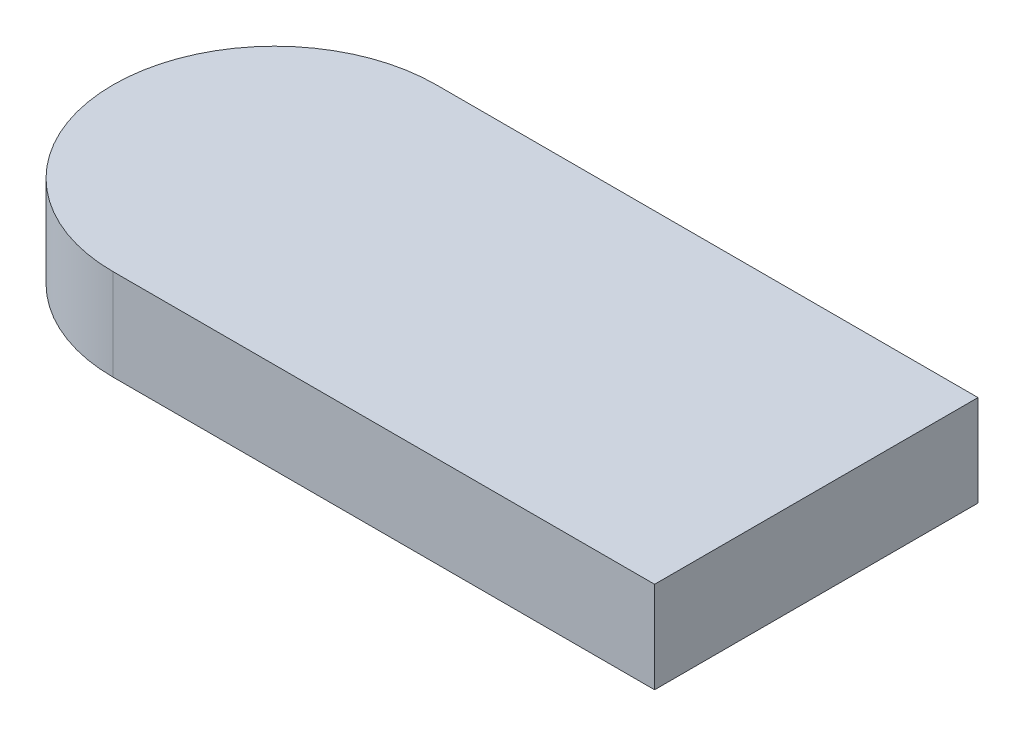
ISO-10303-21;
HEADER;
FILE_DESCRIPTION(('STEP AP214'),'2;1');
FILE_NAME('part.step','',(''),(''),'','','');
FILE_SCHEMA(('AUTOMOTIVE_DESIGN { 1 0 10303 214 1 1 1 1 }'));
ENDSEC;
DATA;
#1=APPLICATION_CONTEXT('core data for automotive mechanical design processes');
#2=APPLICATION_PROTOCOL_DEFINITION('international standard','automotive_design',2000,#1);
#3=PRODUCT_CONTEXT('',#1,'mechanical');
#4=PRODUCT('Part','Part','',(#3));
#5=PRODUCT_RELATED_PRODUCT_CATEGORY('part','',(#4));
#6=PRODUCT_DEFINITION_FORMATION('','',#4);
#7=PRODUCT_DEFINITION_CONTEXT('part definition',#1,'design');
#8=PRODUCT_DEFINITION('design','',#6,#7);
#9=PRODUCT_DEFINITION_SHAPE('','',#8);
#10=(LENGTH_UNIT() NAMED_UNIT(*) SI_UNIT(.MILLI.,.METRE.));
#11=(NAMED_UNIT(*) PLANE_ANGLE_UNIT() SI_UNIT($,.RADIAN.));
#12=(NAMED_UNIT(*) SI_UNIT($,.STERADIAN.) SOLID_ANGLE_UNIT());
#13=UNCERTAINTY_MEASURE_WITH_UNIT(LENGTH_MEASURE(1.E-05),#10,'distance_accuracy_value','');
#14=(GEOMETRIC_REPRESENTATION_CONTEXT(3) GLOBAL_UNCERTAINTY_ASSIGNED_CONTEXT((#13)) GLOBAL_UNIT_ASSIGNED_CONTEXT((#10,
#11,#12)) REPRESENTATION_CONTEXT('',''));
#15=CARTESIAN_POINT('',(0.,0.,0.));
#16=DIRECTION('',(0.,0.,1.));
#17=DIRECTION('',(1.,0.,0.));
#18=AXIS2_PLACEMENT_3D('',#15,#16,#17);
#19=CARTESIAN_POINT('',(0.,3.,0.));
#20=DIRECTION('',(0.,1.,0.));
#21=DIRECTION('',(0.,0.,1.));
#22=AXIS2_PLACEMENT_3D('',#19,#20,#21);
#23=PLANE('',#22);
#24=DIRECTION('',(1.,0.,0.));
#25=VECTOR('',#24,1.);
#26=CARTESIAN_POINT('',(0.,3.,-13.8377945992377));
#27=LINE('',#26,#25);
#28=CARTESIAN_POINT('',(-53.7678162076556,3.,-13.8377945992377));
#29=VERTEX_POINT('',#28);
#30=CARTESIAN_POINT('',(23.2721837923445,3.,-13.8377945992377));
#31=VERTEX_POINT('',#30);
#32=EDGE_CURVE('E165',#29,#31,#27,.T.);
#33=ORIENTED_EDGE('',*,*,#32,.F.);
#34=CARTESIAN_POINT('',(-53.7678162076556,3.,9.16220540076234));
#35=DIRECTION('',(0.,1.,0.));
#36=DIRECTION('',(0.,0.,1.));
#37=AXIS2_PLACEMENT_3D('',#34,#35,#36);
#38=CIRCLE('',#37,23.);
#39=CARTESIAN_POINT('',(-53.7678162076556,3.,32.1622054007623));
#40=VERTEX_POINT('',#39);
#41=EDGE_CURVE('E169',#29,#40,#38,.T.);
#42=ORIENTED_EDGE('',*,*,#41,.T.);
#43=DIRECTION('',(-1.,0.,0.));
#44=VECTOR('',#43,1.);
#45=CARTESIAN_POINT('',(0.,3.,32.1622054007623));
#46=LINE('',#45,#44);
#47=CARTESIAN_POINT('',(23.2721837923445,3.,32.1622054007623));
#48=VERTEX_POINT('',#47);
#49=EDGE_CURVE('E156',#48,#40,#46,.T.);
#50=ORIENTED_EDGE('',*,*,#49,.F.);
#51=DIRECTION('',(0.,0.,1.));
#52=VECTOR('',#51,1.);
#53=CARTESIAN_POINT('',(23.2721837923445,3.,0.));
#54=LINE('',#53,#52);
#55=EDGE_CURVE('E152',#31,#48,#54,.T.);
#56=ORIENTED_EDGE('',*,*,#55,.F.);
#57=EDGE_LOOP('',(#33,#42,#50,#56));
#58=FACE_BOUND('',#57,.T.);
#59=ADVANCED_FACE('F46',(#58),#23,.T.);
#60=CARTESIAN_POINT('',(-53.7678162076556,-12.,9.16220540076234));
#61=DIRECTION('',(0.,1.,0.));
#62=DIRECTION('',(0.,0.,1.));
#63=AXIS2_PLACEMENT_3D('',#60,#61,#62);
#64=CYLINDRICAL_SURFACE('',#63,20.);
#65=DIRECTION('',(0.,1.,0.));
#66=VECTOR('',#65,1.);
#67=CARTESIAN_POINT('',(-53.7678162076556,-12.,-10.8377945992377));
#68=LINE('',#67,#66);
#69=CARTESIAN_POINT('',(-53.7678162076556,-12.,-10.8377945992377));
#70=VERTEX_POINT('',#69);
#71=CARTESIAN_POINT('',(-53.7678162076556,0.,-10.8377945992377));
#72=VERTEX_POINT('',#71);
#73=EDGE_CURVE('E138',#70,#72,#68,.T.);
#74=ORIENTED_EDGE('',*,*,#73,.T.);
#75=CARTESIAN_POINT('',(-53.7678162076556,0.,9.16220540076234));
#76=DIRECTION('',(0.,1.,0.));
#77=DIRECTION('',(0.,0.,1.));
#78=AXIS2_PLACEMENT_3D('',#75,#76,#77);
#79=CIRCLE('',#78,20.);
#80=CARTESIAN_POINT('',(-53.7678162076556,0.,29.1622054007623));
#81=VERTEX_POINT('',#80);
#82=EDGE_CURVE('E196',#72,#81,#79,.T.);
#83=ORIENTED_EDGE('',*,*,#82,.T.);
#84=DIRECTION('',(0.,1.,0.));
#85=VECTOR('',#84,1.);
#86=CARTESIAN_POINT('',(-53.7678162076556,-12.,29.1622054007623));
#87=LINE('',#86,#85);
#88=CARTESIAN_POINT('',(-53.7678162076556,-12.,29.1622054007623));
#89=VERTEX_POINT('',#88);
#90=EDGE_CURVE('E150',#89,#81,#87,.T.);
#91=ORIENTED_EDGE('',*,*,#90,.F.);
#92=CARTESIAN_POINT('',(-53.7678162076556,-12.,9.16220540076234));
#93=DIRECTION('',(0.,1.,0.));
#94=DIRECTION('',(0.,0.,1.));
#95=AXIS2_PLACEMENT_3D('',#92,#93,#94);
#96=CIRCLE('',#95,20.);
#97=EDGE_CURVE('E129',#70,#89,#96,.T.);
#98=ORIENTED_EDGE('',*,*,#97,.F.);
#99=EDGE_LOOP('',(#74,#83,#91,#98));
#100=FACE_BOUND('',#99,.T.);
#101=ADVANCED_FACE('F148',(#100),#64,.F.);
#102=CARTESIAN_POINT('',(0.,-12.,29.1622054007623));
#103=DIRECTION('',(0.,0.,1.));
#104=DIRECTION('',(1.,0.,0.));
#105=AXIS2_PLACEMENT_3D('',#102,#103,#104);
#106=PLANE('',#105);
#107=ORIENTED_EDGE('',*,*,#90,.T.);
#108=DIRECTION('',(1.,0.,0.));
#109=VECTOR('',#108,1.);
#110=CARTESIAN_POINT('',(0.,0.,29.1622054007623));
#111=LINE('',#110,#109);
#112=CARTESIAN_POINT('',(20.2721837923445,0.,29.1622054007623));
#113=VERTEX_POINT('',#112);
#114=EDGE_CURVE('E199',#81,#113,#111,.T.);
#115=ORIENTED_EDGE('',*,*,#114,.T.);
#116=DIRECTION('',(0.,1.,0.));
#117=VECTOR('',#116,1.);
#118=CARTESIAN_POINT('',(20.2721837923445,-12.,29.1622054007623));
#119=LINE('',#118,#117);
#120=CARTESIAN_POINT('',(20.2721837923445,-12.,29.1622054007623));
#121=VERTEX_POINT('',#120);
#122=EDGE_CURVE('E178',#121,#113,#119,.T.);
#123=ORIENTED_EDGE('',*,*,#122,.F.);
#124=DIRECTION('',(1.,0.,0.));
#125=VECTOR('',#124,1.);
#126=CARTESIAN_POINT('',(0.,-12.,29.1622054007623));
#127=LINE('',#126,#125);
#128=EDGE_CURVE('E161',#89,#121,#127,.T.);
#129=ORIENTED_EDGE('',*,*,#128,.F.);
#130=EDGE_LOOP('',(#107,#115,#123,#129));
#131=FACE_BOUND('',#130,.T.);
#132=ADVANCED_FACE('F280',(#131),#106,.F.);
#133=CARTESIAN_POINT('',(20.2721837923445,-12.,0.));
#134=DIRECTION('',(1.,0.,0.));
#135=DIRECTION('',(0.,0.,-1.));
#136=AXIS2_PLACEMENT_3D('',#133,#134,#135);
#137=PLANE('',#136);
#138=ORIENTED_EDGE('',*,*,#122,.T.);
#139=DIRECTION('',(0.,0.,1.));
#140=VECTOR('',#139,1.);
#141=CARTESIAN_POINT('',(20.2721837923445,0.,0.));
#142=LINE('',#141,#140);
#143=CARTESIAN_POINT('',(20.2721837923445,0.,-10.8377945992377));
#144=VERTEX_POINT('',#143);
#145=EDGE_CURVE('E202',#144,#113,#142,.T.);
#146=ORIENTED_EDGE('',*,*,#145,.F.);
#147=DIRECTION('',(0.,1.,0.));
#148=VECTOR('',#147,1.);
#149=CARTESIAN_POINT('',(20.2721837923445,-12.,-10.8377945992377));
#150=LINE('',#149,#148);
#151=CARTESIAN_POINT('',(20.2721837923445,-12.,-10.8377945992377));
#152=VERTEX_POINT('',#151);
#153=EDGE_CURVE('E145',#152,#144,#150,.T.);
#154=ORIENTED_EDGE('',*,*,#153,.F.);
#155=DIRECTION('',(0.,0.,-1.));
#156=VECTOR('',#155,1.);
#157=CARTESIAN_POINT('',(20.2721837923445,-12.,0.));
#158=LINE('',#157,#156);
#159=EDGE_CURVE('E132',#121,#152,#158,.T.);
#160=ORIENTED_EDGE('',*,*,#159,.F.);
#161=EDGE_LOOP('',(#138,#146,#154,#160));
#162=FACE_BOUND('',#161,.T.);
#163=ADVANCED_FACE('F400',(#162),#137,.F.);
#164=CARTESIAN_POINT('',(0.,-12.,-10.8377945992377));
#165=DIRECTION('',(0.,0.,-1.));
#166=DIRECTION('',(-1.,0.,0.));
#167=AXIS2_PLACEMENT_3D('',#164,#165,#166);
#168=PLANE('',#167);
#169=ORIENTED_EDGE('',*,*,#153,.T.);
#170=DIRECTION('',(1.,0.,0.));
#171=VECTOR('',#170,1.);
#172=CARTESIAN_POINT('',(0.,0.,-10.8377945992377));
#173=LINE('',#172,#171);
#174=EDGE_CURVE('E141',#72,#144,#173,.T.);
#175=ORIENTED_EDGE('',*,*,#174,.F.);
#176=ORIENTED_EDGE('',*,*,#73,.F.);
#177=DIRECTION('',(-1.,0.,0.));
#178=VECTOR('',#177,1.);
#179=CARTESIAN_POINT('',(0.,-12.,-10.8377945992377));
#180=LINE('',#179,#178);
#181=EDGE_CURVE('E125',#152,#70,#180,.T.);
#182=ORIENTED_EDGE('',*,*,#181,.F.);
#183=EDGE_LOOP('',(#169,#175,#176,#182));
#184=FACE_BOUND('',#183,.T.);
#185=ADVANCED_FACE('F139',(#184),#168,.F.);
#186=CARTESIAN_POINT('',(0.,-12.,-13.8377945992377));
#187=DIRECTION('',(0.,0.,1.));
#188=DIRECTION('',(1.,0.,0.));
#189=AXIS2_PLACEMENT_3D('',#186,#187,#188);
#190=PLANE('',#189);
#191=DIRECTION('',(0.,1.,0.));
#192=VECTOR('',#191,1.);
#193=CARTESIAN_POINT('',(23.2721837923445,-12.,-13.8377945992377));
#194=LINE('',#193,#192);
#195=CARTESIAN_POINT('',(23.2721837923445,-9.99999999999999,-13.8377945992377));
#196=VERTEX_POINT('',#195);
#197=EDGE_CURVE('E146',#196,#31,#194,.T.);
#198=ORIENTED_EDGE('',*,*,#197,.F.);
#199=DIRECTION('',(-1.,0.,0.));
#200=VECTOR('',#199,1.);
#201=CARTESIAN_POINT('',(0.,-9.99999999999999,-13.8377945992377));
#202=LINE('',#201,#200);
#203=CARTESIAN_POINT('',(-53.7678162076556,-9.99999999999999,-13.8377945992377));
#204=VERTEX_POINT('',#203);
#205=EDGE_CURVE('E57',#196,#204,#202,.T.);
#206=ORIENTED_EDGE('',*,*,#205,.T.);
#207=DIRECTION('',(0.,1.,0.));
#208=VECTOR('',#207,1.);
#209=CARTESIAN_POINT('',(-53.7678162076556,-12.,-13.8377945992377));
#210=LINE('',#209,#208);
#211=EDGE_CURVE('E164',#204,#29,#210,.T.);
#212=ORIENTED_EDGE('',*,*,#211,.T.);
#213=ORIENTED_EDGE('',*,*,#32,.T.);
#214=EDGE_LOOP('',(#198,#206,#212,#213));
#215=FACE_BOUND('',#214,.T.);
#216=ADVANCED_FACE('F284',(#215),#190,.F.);
#217=CARTESIAN_POINT('',(23.2721837923445,-12.,0.));
#218=DIRECTION('',(-1.,0.,0.));
#219=DIRECTION('',(0.,0.,1.));
#220=AXIS2_PLACEMENT_3D('',#217,#218,#219);
#221=PLANE('',#220);
#222=DIRECTION('',(0.,1.,0.));
#223=VECTOR('',#222,1.);
#224=CARTESIAN_POINT('',(23.2721837923445,-12.,32.1622054007623));
#225=LINE('',#224,#223);
#226=CARTESIAN_POINT('',(23.2721837923445,-9.99999999999999,32.1622054007623));
#227=VERTEX_POINT('',#226);
#228=EDGE_CURVE('E186',#227,#48,#225,.T.);
#229=ORIENTED_EDGE('',*,*,#228,.F.);
#230=DIRECTION('',(0.,0.,-1.));
#231=VECTOR('',#230,1.);
#232=CARTESIAN_POINT('',(23.2721837923445,-9.99999999999999,0.));
#233=LINE('',#232,#231);
#234=EDGE_CURVE('E11',#227,#196,#233,.T.);
#235=ORIENTED_EDGE('',*,*,#234,.T.);
#236=ORIENTED_EDGE('',*,*,#197,.T.);
#237=ORIENTED_EDGE('',*,*,#55,.T.);
#238=EDGE_LOOP('',(#229,#235,#236,#237));
#239=FACE_BOUND('',#238,.T.);
#240=ADVANCED_FACE('F324',(#239),#221,.F.);
#241=CARTESIAN_POINT('',(0.,-12.,32.1622054007623));
#242=DIRECTION('',(0.,0.,-1.));
#243=DIRECTION('',(-1.,0.,0.));
#244=AXIS2_PLACEMENT_3D('',#241,#242,#243);
#245=PLANE('',#244);
#246=DIRECTION('',(0.,1.,0.));
#247=VECTOR('',#246,1.);
#248=CARTESIAN_POINT('',(-53.7678162076556,-12.,32.1622054007623));
#249=LINE('',#248,#247);
#250=CARTESIAN_POINT('',(-53.7678162076556,-9.99999999999999,32.1622054007623));
#251=VERTEX_POINT('',#250);
#252=EDGE_CURVE('E189',#251,#40,#249,.T.);
#253=ORIENTED_EDGE('',*,*,#252,.F.);
#254=DIRECTION('',(1.,0.,0.));
#255=VECTOR('',#254,1.);
#256=CARTESIAN_POINT('',(0.,-9.99999999999999,32.1622054007623));
#257=LINE('',#256,#255);
#258=EDGE_CURVE('E219',#251,#227,#257,.T.);
#259=ORIENTED_EDGE('',*,*,#258,.T.);
#260=ORIENTED_EDGE('',*,*,#228,.T.);
#261=ORIENTED_EDGE('',*,*,#49,.T.);
#262=EDGE_LOOP('',(#253,#259,#260,#261));
#263=FACE_BOUND('',#262,.T.);
#264=ADVANCED_FACE('F257',(#263),#245,.F.);
#265=CARTESIAN_POINT('',(-53.7678162076556,-12.,9.16220540076234));
#266=DIRECTION('',(0.,1.,0.));
#267=DIRECTION('',(0.,0.,1.));
#268=AXIS2_PLACEMENT_3D('',#265,#266,#267);
#269=CYLINDRICAL_SURFACE('',#268,23.);
#270=ORIENTED_EDGE('',*,*,#211,.F.);
#271=CARTESIAN_POINT('',(-53.7678162076556,-9.99999999999999,9.16220540076234));
#272=DIRECTION('',(0.,1.,0.));
#273=DIRECTION('',(0.,0.,1.));
#274=AXIS2_PLACEMENT_3D('',#271,#272,#273);
#275=CIRCLE('',#274,23.);
#276=EDGE_CURVE('E223',#204,#251,#275,.T.);
#277=ORIENTED_EDGE('',*,*,#276,.T.);
#278=ORIENTED_EDGE('',*,*,#252,.T.);
#279=ORIENTED_EDGE('',*,*,#41,.F.);
#280=EDGE_LOOP('',(#270,#277,#278,#279));
#281=FACE_BOUND('',#280,.T.);
#282=ADVANCED_FACE('F253',(#281),#269,.T.);
#283=CARTESIAN_POINT('',(0.,-12.,0.));
#284=DIRECTION('',(0.,1.,0.));
#285=DIRECTION('',(0.,0.,1.));
#286=AXIS2_PLACEMENT_3D('',#283,#284,#285);
#287=PLANE('',#286);
#288=DIRECTION('',(0.,0.,1.));
#289=VECTOR('',#288,1.);
#290=CARTESIAN_POINT('',(20.307061855319,-12.,0.));
#291=LINE('',#290,#289);
#292=CARTESIAN_POINT('',(20.307061855319,-12.,-10.8726726622122));
#293=VERTEX_POINT('',#292);
#294=CARTESIAN_POINT('',(20.307061855319,-12.,29.1970834637368));
#295=VERTEX_POINT('',#294);
#296=EDGE_CURVE('E206',#293,#295,#291,.T.);
#297=ORIENTED_EDGE('',*,*,#296,.T.);
#298=DIRECTION('',(-1.,0.,0.));
#299=VECTOR('',#298,1.);
#300=CARTESIAN_POINT('',(0.,-12.,29.1970834637368));
#301=LINE('',#300,#299);
#302=CARTESIAN_POINT('',(-53.7678162076556,-12.,29.1970834637369));
#303=VERTEX_POINT('',#302);
#304=EDGE_CURVE('E215',#295,#303,#301,.T.);
#305=ORIENTED_EDGE('',*,*,#304,.T.);
#306=CARTESIAN_POINT('',(-53.7678162076556,-12.,9.16220540076234));
#307=DIRECTION('',(0.,1.,0.));
#308=DIRECTION('',(0.,0.,1.));
#309=AXIS2_PLACEMENT_3D('',#306,#307,#308);
#310=CIRCLE('',#309,20.0348780629745);
#311=CARTESIAN_POINT('',(-53.7678162076556,-12.,-10.8726726622122));
#312=VERTEX_POINT('',#311);
#313=EDGE_CURVE('E212',#303,#312,#310,.F.);
#314=ORIENTED_EDGE('',*,*,#313,.T.);
#315=DIRECTION('',(1.,0.,0.));
#316=VECTOR('',#315,1.);
#317=CARTESIAN_POINT('',(0.,-12.,-10.8726726622122));
#318=LINE('',#317,#316);
#319=EDGE_CURVE('E209',#312,#293,#318,.T.);
#320=ORIENTED_EDGE('',*,*,#319,.T.);
#321=EDGE_LOOP('',(#297,#305,#314,#320));
#322=FACE_BOUND('',#321,.T.);
#323=ORIENTED_EDGE('',*,*,#97,.T.);
#324=ORIENTED_EDGE('',*,*,#128,.T.);
#325=ORIENTED_EDGE('',*,*,#159,.T.);
#326=ORIENTED_EDGE('',*,*,#181,.T.);
#327=EDGE_LOOP('',(#323,#324,#325,#326));
#328=FACE_BOUND('',#327,.T.);
#329=ADVANCED_FACE('F127',(#322,#328),#287,.F.);
#330=CARTESIAN_POINT('',(0.,0.,0.));
#331=DIRECTION('',(0.,1.,0.));
#332=DIRECTION('',(0.,0.,1.));
#333=AXIS2_PLACEMENT_3D('',#330,#331,#332);
#334=PLANE('',#333);
#335=ORIENTED_EDGE('',*,*,#174,.T.);
#336=ORIENTED_EDGE('',*,*,#145,.T.);
#337=ORIENTED_EDGE('',*,*,#114,.F.);
#338=ORIENTED_EDGE('',*,*,#82,.F.);
#339=EDGE_LOOP('',(#335,#336,#337,#338));
#340=FACE_BOUND('',#339,.T.);
#341=ADVANCED_FACE('F264',(#340),#334,.F.);
#342=CARTESIAN_POINT('',(0.,-12.,-10.8726726622122));
#343=DIRECTION('',(0.,0.829037572555041,0.559192903470748));
#344=DIRECTION('',(1.,0.,0.));
#345=AXIS2_PLACEMENT_3D('',#342,#343,#344);
#346=PLANE('',#345);
#347=DIRECTION('',(0.,-0.559192903470748,0.829037572555041));
#348=VECTOR('',#347,1.);
#349=CARTESIAN_POINT('',(-53.7678162076556,-9.99999999999999,-13.8377945992377));
#350=LINE('',#349,#348);
#351=EDGE_CURVE('E233',#204,#312,#350,.T.);
#352=ORIENTED_EDGE('',*,*,#351,.F.);
#353=ORIENTED_EDGE('',*,*,#205,.F.);
#354=DIRECTION('',(0.638230619643254,0.430491988658995,-0.638230619643254));
#355=VECTOR('',#354,1.);
#356=CARTESIAN_POINT('',(15.8782055973214,-14.9873012658902,-6.44381640421465));
#357=LINE('',#356,#355);
#358=EDGE_CURVE('E51',#293,#196,#357,.T.);
#359=ORIENTED_EDGE('',*,*,#358,.F.);
#360=ORIENTED_EDGE('',*,*,#319,.F.);
#361=EDGE_LOOP('',(#352,#353,#359,#360));
#362=FACE_BOUND('',#361,.T.);
#363=ADVANCED_FACE('F49',(#362),#346,.F.);
#364=CARTESIAN_POINT('',(20.307061855319,-12.,0.));
#365=DIRECTION('',(-0.559192903470748,0.829037572555041,0.));
#366=DIRECTION('',(0.,0.,1.));
#367=AXIS2_PLACEMENT_3D('',#364,#365,#366);
#368=PLANE('',#367);
#369=ORIENTED_EDGE('',*,*,#358,.T.);
#370=ORIENTED_EDGE('',*,*,#234,.F.);
#371=DIRECTION('',(-0.638230619643254,-0.430491988658995,-0.638230619643254));
#372=VECTOR('',#371,1.);
#373=CARTESIAN_POINT('',(8.41397081588567,-20.0219911976801,17.3039924243035));
#374=LINE('',#373,#372);
#375=EDGE_CURVE('E231',#295,#227,#374,.F.);
#376=ORIENTED_EDGE('',*,*,#375,.F.);
#377=ORIENTED_EDGE('',*,*,#296,.F.);
#378=EDGE_LOOP('',(#369,#370,#376,#377));
#379=FACE_BOUND('',#378,.T.);
#380=ADVANCED_FACE('F245',(#379),#368,.F.);
#381=CARTESIAN_POINT('',(-53.7678162076556,-9.99999999999999,9.16220540076234));
#382=DIRECTION('',(0.,1.,0.));
#383=DIRECTION('',(0.,0.,1.));
#384=AXIS2_PLACEMENT_3D('',#381,#382,#383);
#385=CONICAL_SURFACE('',#384,23.,0.977384381116823);
#386=ORIENTED_EDGE('',*,*,#351,.T.);
#387=ORIENTED_EDGE('',*,*,#313,.F.);
#388=DIRECTION('',(0.,-0.559192903470748,-0.829037572555041));
#389=VECTOR('',#388,1.);
#390=CARTESIAN_POINT('',(-53.7678162076556,-9.99999999999999,32.1622054007623));
#391=LINE('',#390,#389);
#392=EDGE_CURVE('E228',#251,#303,#391,.T.);
#393=ORIENTED_EDGE('',*,*,#392,.F.);
#394=ORIENTED_EDGE('',*,*,#276,.F.);
#395=EDGE_LOOP('',(#386,#387,#393,#394));
#396=FACE_BOUND('',#395,.T.);
#397=ADVANCED_FACE('F250',(#396),#385,.T.);
#398=CARTESIAN_POINT('',(0.,-12.,29.1970834637368));
#399=DIRECTION('',(0.,0.829037572555041,-0.559192903470748));
#400=DIRECTION('',(-1.,0.,0.));
#401=AXIS2_PLACEMENT_3D('',#398,#399,#400);
#402=PLANE('',#401);
#403=ORIENTED_EDGE('',*,*,#375,.T.);
#404=ORIENTED_EDGE('',*,*,#258,.F.);
#405=ORIENTED_EDGE('',*,*,#392,.T.);
#406=ORIENTED_EDGE('',*,*,#304,.F.);
#407=EDGE_LOOP('',(#403,#404,#405,#406));
#408=FACE_BOUND('',#407,.T.);
#409=ADVANCED_FACE('F260',(#408),#402,.F.);
#410=CLOSED_SHELL('',(#59,#101,#132,#163,#185,#216,#240,#264,#282,#329,#341,#363,#380,#397,#409));
#411=MANIFOLD_SOLID_BREP('B2',#410);
#412=ADVANCED_BREP_SHAPE_REPRESENTATION('',(#18,#411),#14);
#413=SHAPE_DEFINITION_REPRESENTATION(#9,#412);
ENDSEC;
END-ISO-10303-21;
